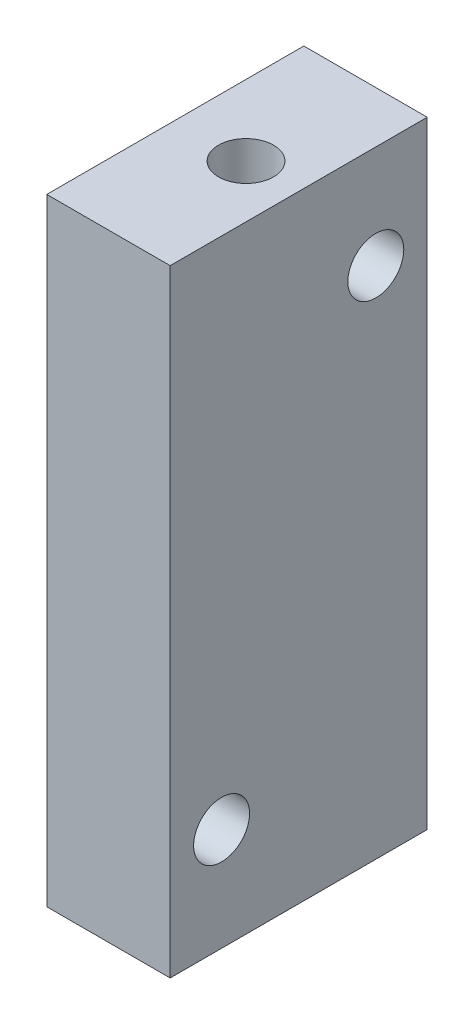
ISO-10303-21;
HEADER;
FILE_DESCRIPTION(('STEP AP214'),'2;1');
FILE_NAME('part.step','',(''),(''),'','','');
FILE_SCHEMA(('AUTOMOTIVE_DESIGN { 1 0 10303 214 1 1 1 1 }'));
ENDSEC;
DATA;
#1=APPLICATION_CONTEXT('core data for automotive mechanical design processes');
#2=APPLICATION_PROTOCOL_DEFINITION('international standard','automotive_design',2000,#1);
#3=PRODUCT_CONTEXT('',#1,'mechanical');
#4=PRODUCT('Part','Part','',(#3));
#5=PRODUCT_RELATED_PRODUCT_CATEGORY('part','',(#4));
#6=PRODUCT_DEFINITION_FORMATION('','',#4);
#7=PRODUCT_DEFINITION_CONTEXT('part definition',#1,'design');
#8=PRODUCT_DEFINITION('design','',#6,#7);
#9=PRODUCT_DEFINITION_SHAPE('','',#8);
#10=(LENGTH_UNIT() NAMED_UNIT(*) SI_UNIT(.MILLI.,.METRE.));
#11=(NAMED_UNIT(*) PLANE_ANGLE_UNIT() SI_UNIT($,.RADIAN.));
#12=(NAMED_UNIT(*) SI_UNIT($,.STERADIAN.) SOLID_ANGLE_UNIT());
#13=UNCERTAINTY_MEASURE_WITH_UNIT(LENGTH_MEASURE(1.E-05),#10,'distance_accuracy_value','');
#14=(GEOMETRIC_REPRESENTATION_CONTEXT(3) GLOBAL_UNCERTAINTY_ASSIGNED_CONTEXT((#13)) GLOBAL_UNIT_ASSIGNED_CONTEXT((#10,
#11,#12)) REPRESENTATION_CONTEXT('',''));
#15=CARTESIAN_POINT('',(0.,0.,0.));
#16=DIRECTION('',(0.,0.,1.));
#17=DIRECTION('',(1.,0.,0.));
#18=AXIS2_PLACEMENT_3D('',#15,#16,#17);
#19=CARTESIAN_POINT('',(7.62,-19.05,-7.9375));
#20=DIRECTION('',(0.,1.,0.));
#21=DIRECTION('',(0.,0.,1.));
#22=AXIS2_PLACEMENT_3D('',#19,#20,#21);
#23=PLANE('',#22);
#24=CARTESIAN_POINT('',(4.36625,-19.05,0.));
#25=DIRECTION('',(0.,-1.,0.));
#26=DIRECTION('',(0.,0.,-1.));
#27=AXIS2_PLACEMENT_3D('',#24,#25,#26);
#28=CIRCLE('',#27,1.7);
#29=CARTESIAN_POINT('',(4.36625,-19.05,-1.7));
#30=VERTEX_POINT('',#29);
#31=EDGE_CURVE('E115',#30,#30,#28,.T.);
#32=ORIENTED_EDGE('',*,*,#31,.F.);
#33=EDGE_LOOP('',(#32));
#34=FACE_BOUND('',#33,.T.);
#35=DIRECTION('',(0.,0.,-1.));
#36=VECTOR('',#35,1.);
#37=CARTESIAN_POINT('',(0.,-19.05,-7.9375));
#38=LINE('',#37,#36);
#39=CARTESIAN_POINT('',(0.,-19.05,7.9375));
#40=VERTEX_POINT('',#39);
#41=CARTESIAN_POINT('',(0.,-19.05,-7.9375));
#42=VERTEX_POINT('',#41);
#43=EDGE_CURVE('E105',#40,#42,#38,.T.);
#44=ORIENTED_EDGE('',*,*,#43,.T.);
#45=DIRECTION('',(-1.,0.,0.));
#46=VECTOR('',#45,1.);
#47=CARTESIAN_POINT('',(7.62,-19.05,-7.9375));
#48=LINE('',#47,#46);
#49=CARTESIAN_POINT('',(7.62,-19.05,-7.9375));
#50=VERTEX_POINT('',#49);
#51=EDGE_CURVE('E11',#50,#42,#48,.T.);
#52=ORIENTED_EDGE('',*,*,#51,.F.);
#53=DIRECTION('',(0.,0.,-1.));
#54=VECTOR('',#53,1.);
#55=CARTESIAN_POINT('',(7.62,-19.05,-7.9375));
#56=LINE('',#55,#54);
#57=CARTESIAN_POINT('',(7.62,-19.05,7.9375));
#58=VERTEX_POINT('',#57);
#59=EDGE_CURVE('E92',#58,#50,#56,.T.);
#60=ORIENTED_EDGE('',*,*,#59,.F.);
#61=DIRECTION('',(-1.,0.,0.));
#62=VECTOR('',#61,1.);
#63=CARTESIAN_POINT('',(7.62,-19.05,7.9375));
#64=LINE('',#63,#62);
#65=EDGE_CURVE('E101',#58,#40,#64,.T.);
#66=ORIENTED_EDGE('',*,*,#65,.T.);
#67=EDGE_LOOP('',(#44,#52,#60,#66));
#68=FACE_BOUND('',#67,.T.);
#69=ADVANCED_FACE('F39',(#34,#68),#23,.F.);
#70=CARTESIAN_POINT('',(7.62,19.05,-7.9375));
#71=DIRECTION('',(0.,0.,1.));
#72=DIRECTION('',(0.,-1.,0.));
#73=AXIS2_PLACEMENT_3D('',#70,#71,#72);
#74=PLANE('',#73);
#75=DIRECTION('',(0.,1.,0.));
#76=VECTOR('',#75,1.);
#77=CARTESIAN_POINT('',(0.,19.05,-7.9375));
#78=LINE('',#77,#76);
#79=CARTESIAN_POINT('',(0.,19.05,-7.9375));
#80=VERTEX_POINT('',#79);
#81=EDGE_CURVE('E96',#42,#80,#78,.T.);
#82=ORIENTED_EDGE('',*,*,#81,.T.);
#83=DIRECTION('',(-1.,0.,0.));
#84=VECTOR('',#83,1.);
#85=CARTESIAN_POINT('',(7.62,19.05,-7.9375));
#86=LINE('',#85,#84);
#87=CARTESIAN_POINT('',(7.62,19.05,-7.9375));
#88=VERTEX_POINT('',#87);
#89=EDGE_CURVE('E48',#88,#80,#86,.T.);
#90=ORIENTED_EDGE('',*,*,#89,.F.);
#91=DIRECTION('',(0.,1.,0.));
#92=VECTOR('',#91,1.);
#93=CARTESIAN_POINT('',(7.62,19.05,-7.9375));
#94=LINE('',#93,#92);
#95=EDGE_CURVE('E87',#50,#88,#94,.T.);
#96=ORIENTED_EDGE('',*,*,#95,.F.);
#97=ORIENTED_EDGE('',*,*,#51,.T.);
#98=EDGE_LOOP('',(#82,#90,#96,#97));
#99=FACE_BOUND('',#98,.T.);
#100=ADVANCED_FACE('F95',(#99),#74,.F.);
#101=CARTESIAN_POINT('',(7.62,19.05,-7.9375));
#102=DIRECTION('',(0.,-1.,0.));
#103=DIRECTION('',(0.,0.,-1.));
#104=AXIS2_PLACEMENT_3D('',#101,#102,#103);
#105=PLANE('',#104);
#106=CARTESIAN_POINT('',(4.36625,19.05,0.));
#107=DIRECTION('',(0.,-1.,0.));
#108=DIRECTION('',(0.,0.,-1.));
#109=AXIS2_PLACEMENT_3D('',#106,#107,#108);
#110=CIRCLE('',#109,1.7);
#111=CARTESIAN_POINT('',(4.36625,19.05,-1.7));
#112=VERTEX_POINT('',#111);
#113=EDGE_CURVE('E108',#112,#112,#110,.T.);
#114=ORIENTED_EDGE('',*,*,#113,.T.);
#115=EDGE_LOOP('',(#114));
#116=FACE_BOUND('',#115,.T.);
#117=DIRECTION('',(0.,0.,1.));
#118=VECTOR('',#117,1.);
#119=CARTESIAN_POINT('',(0.,19.05,-7.9375));
#120=LINE('',#119,#118);
#121=CARTESIAN_POINT('',(0.,19.05,7.9375));
#122=VERTEX_POINT('',#121);
#123=EDGE_CURVE('E74',#80,#122,#120,.T.);
#124=ORIENTED_EDGE('',*,*,#123,.T.);
#125=DIRECTION('',(-1.,0.,0.));
#126=VECTOR('',#125,1.);
#127=CARTESIAN_POINT('',(7.62,19.05,7.9375));
#128=LINE('',#127,#126);
#129=CARTESIAN_POINT('',(7.62,19.05,7.9375));
#130=VERTEX_POINT('',#129);
#131=EDGE_CURVE('E97',#130,#122,#128,.T.);
#132=ORIENTED_EDGE('',*,*,#131,.F.);
#133=DIRECTION('',(0.,0.,1.));
#134=VECTOR('',#133,1.);
#135=CARTESIAN_POINT('',(7.62,19.05,-7.9375));
#136=LINE('',#135,#134);
#137=EDGE_CURVE('E90',#88,#130,#136,.T.);
#138=ORIENTED_EDGE('',*,*,#137,.F.);
#139=ORIENTED_EDGE('',*,*,#89,.T.);
#140=EDGE_LOOP('',(#124,#132,#138,#139));
#141=FACE_BOUND('',#140,.T.);
#142=ADVANCED_FACE('F99',(#116,#141),#105,.F.);
#143=CARTESIAN_POINT('',(7.62,19.05,7.9375));
#144=DIRECTION('',(0.,0.,-1.));
#145=DIRECTION('',(0.,1.,0.));
#146=AXIS2_PLACEMENT_3D('',#143,#144,#145);
#147=PLANE('',#146);
#148=DIRECTION('',(0.,-1.,0.));
#149=VECTOR('',#148,1.);
#150=CARTESIAN_POINT('',(0.,19.05,7.9375));
#151=LINE('',#150,#149);
#152=EDGE_CURVE('E80',#122,#40,#151,.T.);
#153=ORIENTED_EDGE('',*,*,#152,.T.);
#154=ORIENTED_EDGE('',*,*,#65,.F.);
#155=DIRECTION('',(0.,-1.,0.));
#156=VECTOR('',#155,1.);
#157=CARTESIAN_POINT('',(7.62,19.05,7.9375));
#158=LINE('',#157,#156);
#159=EDGE_CURVE('E57',#130,#58,#158,.T.);
#160=ORIENTED_EDGE('',*,*,#159,.F.);
#161=ORIENTED_EDGE('',*,*,#131,.T.);
#162=EDGE_LOOP('',(#153,#154,#160,#161));
#163=FACE_BOUND('',#162,.T.);
#164=ADVANCED_FACE('F151',(#163),#147,.F.);
#165=CARTESIAN_POINT('',(7.62,0.,0.));
#166=DIRECTION('',(1.,0.,0.));
#167=DIRECTION('',(0.,0.,-1.));
#168=AXIS2_PLACEMENT_3D('',#165,#166,#167);
#169=PLANE('',#168);
#170=CARTESIAN_POINT('',(7.62,-12.7,4.7625));
#171=DIRECTION('',(1.,0.,0.));
#172=DIRECTION('',(0.,0.,-1.));
#173=AXIS2_PLACEMENT_3D('',#170,#171,#172);
#174=CIRCLE('',#173,1.7272);
#175=CARTESIAN_POINT('',(7.62,-12.7,3.0353));
#176=VERTEX_POINT('',#175);
#177=EDGE_CURVE('E126',#176,#176,#174,.F.);
#178=ORIENTED_EDGE('',*,*,#177,.T.);
#179=EDGE_LOOP('',(#178));
#180=FACE_BOUND('',#179,.T.);
#181=CARTESIAN_POINT('',(7.62,12.7,-4.7625));
#182=DIRECTION('',(1.,0.,0.));
#183=DIRECTION('',(0.,0.,-1.));
#184=AXIS2_PLACEMENT_3D('',#181,#182,#183);
#185=CIRCLE('',#184,1.7272);
#186=CARTESIAN_POINT('',(7.62,12.7,-6.4897));
#187=VERTEX_POINT('',#186);
#188=EDGE_CURVE('E118',#187,#187,#185,.F.);
#189=ORIENTED_EDGE('',*,*,#188,.T.);
#190=EDGE_LOOP('',(#189));
#191=FACE_BOUND('',#190,.T.);
#192=ORIENTED_EDGE('',*,*,#59,.T.);
#193=ORIENTED_EDGE('',*,*,#95,.T.);
#194=ORIENTED_EDGE('',*,*,#137,.T.);
#195=ORIENTED_EDGE('',*,*,#159,.T.);
#196=EDGE_LOOP('',(#192,#193,#194,#195));
#197=FACE_BOUND('',#196,.T.);
#198=ADVANCED_FACE('F88',(#180,#191,#197),#169,.T.);
#199=CARTESIAN_POINT('',(0.,0.,0.));
#200=DIRECTION('',(1.,0.,0.));
#201=DIRECTION('',(0.,0.,-1.));
#202=AXIS2_PLACEMENT_3D('',#199,#200,#201);
#203=PLANE('',#202);
#204=CARTESIAN_POINT('',(0.,-12.7,4.7625));
#205=DIRECTION('',(1.,0.,0.));
#206=DIRECTION('',(0.,0.,-1.));
#207=AXIS2_PLACEMENT_3D('',#204,#205,#206);
#208=CIRCLE('',#207,1.7272);
#209=CARTESIAN_POINT('',(0.,-12.7,3.0353));
#210=VERTEX_POINT('',#209);
#211=EDGE_CURVE('E42',#210,#210,#208,.F.);
#212=ORIENTED_EDGE('',*,*,#211,.F.);
#213=EDGE_LOOP('',(#212));
#214=FACE_BOUND('',#213,.T.);
#215=CARTESIAN_POINT('',(0.,12.7,-4.7625));
#216=DIRECTION('',(1.,0.,0.));
#217=DIRECTION('',(0.,0.,-1.));
#218=AXIS2_PLACEMENT_3D('',#215,#216,#217);
#219=CIRCLE('',#218,1.7272);
#220=CARTESIAN_POINT('',(0.,12.7,-6.4897));
#221=VERTEX_POINT('',#220);
#222=EDGE_CURVE('E116',#221,#221,#219,.F.);
#223=ORIENTED_EDGE('',*,*,#222,.F.);
#224=EDGE_LOOP('',(#223));
#225=FACE_BOUND('',#224,.T.);
#226=ORIENTED_EDGE('',*,*,#43,.F.);
#227=ORIENTED_EDGE('',*,*,#152,.F.);
#228=ORIENTED_EDGE('',*,*,#123,.F.);
#229=ORIENTED_EDGE('',*,*,#81,.F.);
#230=EDGE_LOOP('',(#226,#227,#228,#229));
#231=FACE_BOUND('',#230,.T.);
#232=ADVANCED_FACE('F140',(#214,#225,#231),#203,.F.);
#233=CARTESIAN_POINT('',(4.36625,30.4165,0.));
#234=DIRECTION('',(0.,-1.,0.));
#235=DIRECTION('',(0.,0.,-1.));
#236=AXIS2_PLACEMENT_3D('',#233,#234,#235);
#237=CYLINDRICAL_SURFACE('',#236,1.7);
#238=ORIENTED_EDGE('',*,*,#31,.T.);
#239=EDGE_LOOP('',(#238));
#240=FACE_BOUND('',#239,.T.);
#241=ORIENTED_EDGE('',*,*,#113,.F.);
#242=EDGE_LOOP('',(#241));
#243=FACE_BOUND('',#242,.T.);
#244=ADVANCED_FACE('F133',(#240,#243),#237,.F.);
#245=CARTESIAN_POINT('',(10.922,12.7,-4.7625));
#246=DIRECTION('',(-1.,0.,0.));
#247=DIRECTION('',(0.,0.,1.));
#248=AXIS2_PLACEMENT_3D('',#245,#246,#247);
#249=CYLINDRICAL_SURFACE('',#248,1.7272);
#250=ORIENTED_EDGE('',*,*,#188,.F.);
#251=EDGE_LOOP('',(#250));
#252=FACE_BOUND('',#251,.T.);
#253=ORIENTED_EDGE('',*,*,#222,.T.);
#254=EDGE_LOOP('',(#253));
#255=FACE_BOUND('',#254,.T.);
#256=ADVANCED_FACE('F149',(#252,#255),#249,.F.);
#257=CARTESIAN_POINT('',(10.922,-12.7,4.7625));
#258=DIRECTION('',(-1.,0.,0.));
#259=DIRECTION('',(0.,0.,1.));
#260=AXIS2_PLACEMENT_3D('',#257,#258,#259);
#261=CYLINDRICAL_SURFACE('',#260,1.7272);
#262=ORIENTED_EDGE('',*,*,#177,.F.);
#263=EDGE_LOOP('',(#262));
#264=FACE_BOUND('',#263,.T.);
#265=ORIENTED_EDGE('',*,*,#211,.T.);
#266=EDGE_LOOP('',(#265));
#267=FACE_BOUND('',#266,.T.);
#268=ADVANCED_FACE('F202',(#264,#267),#261,.F.);
#269=CLOSED_SHELL('',(#69,#100,#142,#164,#198,#232,#244,#256,#268));
#270=MANIFOLD_SOLID_BREP('B2',#269);
#271=ADVANCED_BREP_SHAPE_REPRESENTATION('',(#18,#270),#14);
#272=SHAPE_DEFINITION_REPRESENTATION(#9,#271);
ENDSEC;
END-ISO-10303-21;
